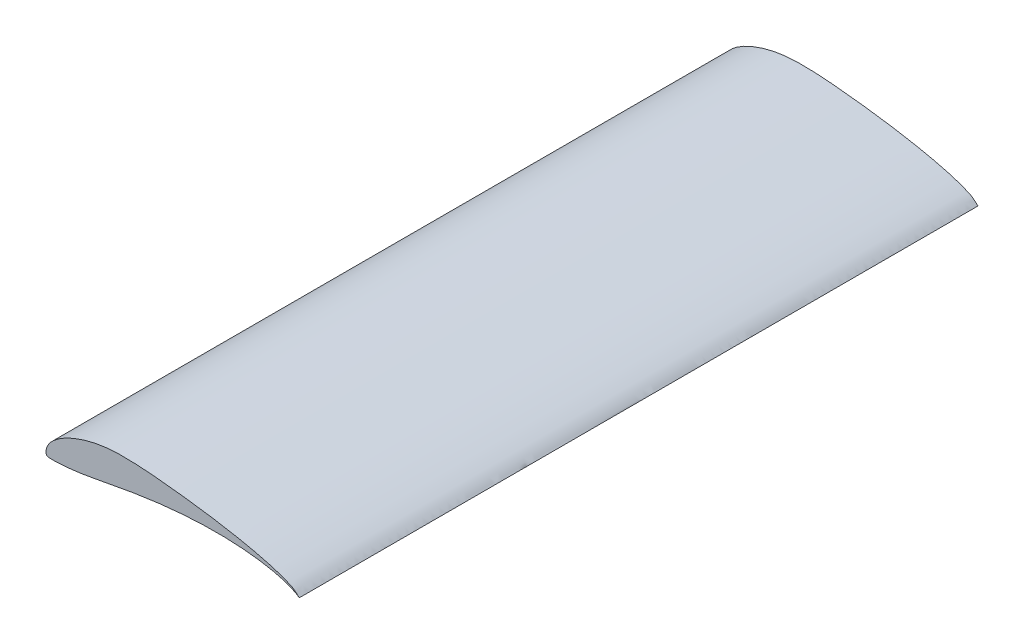
ISO-10303-21;
HEADER;
FILE_DESCRIPTION(('STEP AP214'),'2;1');
FILE_NAME('part.step','',(''),(''),'','','');
FILE_SCHEMA(('AUTOMOTIVE_DESIGN { 1 0 10303 214 1 1 1 1 }'));
ENDSEC;
DATA;
#1=APPLICATION_CONTEXT('core data for automotive mechanical design processes');
#2=APPLICATION_PROTOCOL_DEFINITION('international standard','automotive_design',2000,#1);
#3=PRODUCT_CONTEXT('',#1,'mechanical');
#4=PRODUCT('Part','Part','',(#3));
#5=PRODUCT_RELATED_PRODUCT_CATEGORY('part','',(#4));
#6=PRODUCT_DEFINITION_FORMATION('','',#4);
#7=PRODUCT_DEFINITION_CONTEXT('part definition',#1,'design');
#8=PRODUCT_DEFINITION('design','',#6,#7);
#9=PRODUCT_DEFINITION_SHAPE('','',#8);
#10=(LENGTH_UNIT() NAMED_UNIT(*) SI_UNIT(.MILLI.,.METRE.));
#11=(NAMED_UNIT(*) PLANE_ANGLE_UNIT() SI_UNIT($,.RADIAN.));
#12=(NAMED_UNIT(*) SI_UNIT($,.STERADIAN.) SOLID_ANGLE_UNIT());
#13=UNCERTAINTY_MEASURE_WITH_UNIT(LENGTH_MEASURE(1.E-05),#10,'distance_accuracy_value','');
#14=(GEOMETRIC_REPRESENTATION_CONTEXT(3) GLOBAL_UNCERTAINTY_ASSIGNED_CONTEXT((#13)) GLOBAL_UNIT_ASSIGNED_CONTEXT((#10,
#11,#12)) REPRESENTATION_CONTEXT('',''));
#15=CARTESIAN_POINT('',(0.,0.,0.));
#16=DIRECTION('',(0.,0.,1.));
#17=DIRECTION('',(1.,0.,0.));
#18=AXIS2_PLACEMENT_3D('',#15,#16,#17);
#19=CARTESIAN_POINT('',(355.6,0.,952.5));
#20=CARTESIAN_POINT('',(355.602128839233,0.00905257865664255,952.5));
#21=CARTESIAN_POINT('',(354.433140978384,0.8800281610502,952.5));
#22=CARTESIAN_POINT('',(353.444501711092,1.85005455162459,952.5));
#23=CARTESIAN_POINT('',(351.249323177412,3.87614569589336,952.5));
#24=CARTESIAN_POINT('',(348.659525751766,6.03151924957843,952.5));
#25=CARTESIAN_POINT('',(345.116905318303,8.20437560749415,952.5));
#26=CARTESIAN_POINT('',(340.711629882798,10.3101190603646,952.5));
#27=CARTESIAN_POINT('',(335.393425673829,12.5077174088594,952.5));
#28=CARTESIAN_POINT('',(329.170399195785,14.7665711312823,952.5));
#29=CARTESIAN_POINT('',(322.07158272521,17.0707231031482,952.5));
#30=CARTESIAN_POINT('',(314.13382869535,19.4001677933744,952.5));
#31=CARTESIAN_POINT('',(305.401586316021,21.7439719074938,952.5));
#32=CARTESIAN_POINT('',(295.923071256142,24.0806148471079,952.5));
#33=CARTESIAN_POINT('',(285.752626316274,26.3931817659485,952.5));
#34=CARTESIAN_POINT('',(274.950869855428,28.6672283865245,952.5));
#35=CARTESIAN_POINT('',(263.583762408773,30.8910643713945,952.5));
#36=CARTESIAN_POINT('',(251.717739615531,33.0373241061143,952.5));
#37=CARTESIAN_POINT('',(239.427524052225,35.10294120027,952.5));
#38=CARTESIAN_POINT('',(226.783945210423,37.061316862598,952.5));
#39=CARTESIAN_POINT('',(213.868769441891,38.9162752047643,952.5));
#40=CARTESIAN_POINT('',(200.764767606806,40.6531166071968,952.5));
#41=CARTESIAN_POINT('',(187.566852051127,42.2662832725131,952.5));
#42=CARTESIAN_POINT('',(174.380530098979,43.7671972953088,952.5));
#43=CARTESIAN_POINT('',(161.314964856538,45.1179867380239,952.5));
#44=CARTESIAN_POINT('',(148.476599483251,46.2933700407377,952.5));
#45=CARTESIAN_POINT('',(135.955728548367,47.2271902117008,952.5));
#46=CARTESIAN_POINT('',(123.823875864113,47.8695386381412,952.5));
#47=CARTESIAN_POINT('',(112.148534892479,48.1469346178072,952.5));
#48=CARTESIAN_POINT('',(100.989516745191,48.1174076280814,952.5));
#49=CARTESIAN_POINT('',(90.3676373078495,47.5710294725793,952.5));
#50=CARTESIAN_POINT('',(80.2787819547357,46.4638187537541,952.5));
#51=CARTESIAN_POINT('',(70.6818812127756,44.8982063778645,952.5));
#52=CARTESIAN_POINT('',(61.5746188615317,42.8699693660453,952.5));
#53=CARTESIAN_POINT('',(52.9663512848568,40.4915785454029,952.5));
#54=CARTESIAN_POINT('',(44.8935011264766,37.8051588588699,952.5));
#55=CARTESIAN_POINT('',(37.3904014736481,34.8735323274963,952.5));
#56=CARTESIAN_POINT('',(30.5036774663957,31.712405529247,952.5));
#57=CARTESIAN_POINT('',(24.2554145014104,28.3859584320498,952.5));
#58=CARTESIAN_POINT('',(18.6796051822039,24.9320191651614,952.5));
#59=CARTESIAN_POINT('',(13.811215985407,21.3973916013314,952.5));
#60=CARTESIAN_POINT('',(9.65225560370303,17.8569964494132,952.5));
#61=CARTESIAN_POINT('',(6.26303626987923,14.2721876357294,952.5));
#62=CARTESIAN_POINT('',(3.65968351969902,10.6740096816049,952.5));
#63=CARTESIAN_POINT('',(1.73665241115201,7.17346172131277,952.5));
#64=CARTESIAN_POINT('',(0.504192981572073,3.84985728346983,952.5));
#65=CARTESIAN_POINT('',(-0.0830739963663081,0.782171392686961,952.5));
#66=CARTESIAN_POINT('',(0.0302844236153766,-1.81236374784161,952.5));
#67=CARTESIAN_POINT('',(0.698257611801773,-4.19197054401551,952.5));
#68=CARTESIAN_POINT('',(3.18122091187247,-5.37322479022704,952.5));
#69=CARTESIAN_POINT('',(6.51959767179163,-5.5389510407461,952.5));
#70=CARTESIAN_POINT('',(11.0864846329763,-5.69957357450488,952.5));
#71=CARTESIAN_POINT('',(16.8296672974033,-5.45191547845621,952.5));
#72=CARTESIAN_POINT('',(23.6842363561708,-4.99679537096036,952.5));
#73=CARTESIAN_POINT('',(31.5739076107665,-4.26779164951018,952.5));
#74=CARTESIAN_POINT('',(40.4179478604171,-3.28141827021386,952.5));
#75=CARTESIAN_POINT('',(50.1732312409953,-2.01650943971448,952.5));
#76=CARTESIAN_POINT('',(60.8349904894309,-0.24861113661137,952.5));
#77=CARTESIAN_POINT('',(72.4551367968201,1.96830467841738,952.5));
#78=CARTESIAN_POINT('',(85.0917630728771,4.38101652220943,952.5));
#79=CARTESIAN_POINT('',(98.6831025194234,6.9284943271742,952.5));
#80=CARTESIAN_POINT('',(113.143787230334,9.50500042119454,952.5));
#81=CARTESIAN_POINT('',(128.367617419531,12.013841552219,952.5));
#82=CARTESIAN_POINT('',(144.236485554588,14.3712409496977,952.5));
#83=CARTESIAN_POINT('',(160.613634461524,16.4907207241703,952.5));
#84=CARTESIAN_POINT('',(177.351789026275,18.3105667389564,952.5));
#85=CARTESIAN_POINT('',(194.292835689016,19.7490800809445,952.5));
#86=CARTESIAN_POINT('',(211.266766871471,20.7688086640634,952.5));
#87=CARTESIAN_POINT('',(228.096248564287,21.3294099490697,952.5));
#88=CARTESIAN_POINT('',(244.598710423796,21.4002179081022,952.5));
#89=CARTESIAN_POINT('',(260.590041642155,20.9764214709169,952.5));
#90=CARTESIAN_POINT('',(275.887132003497,20.067941794691,952.5));
#91=CARTESIAN_POINT('',(290.306036162185,18.6865007136707,952.5));
#92=CARTESIAN_POINT('',(303.675088430976,16.8851246883896,952.5));
#93=CARTESIAN_POINT('',(315.820228030423,14.7160828611717,952.5));
#94=CARTESIAN_POINT('',(326.599058576612,12.2520191308015,952.5));
#95=CARTESIAN_POINT('',(335.812931173765,9.61536116540537,952.5));
#96=CARTESIAN_POINT('',(343.353535673268,6.80129216120097,952.5));
#97=CARTESIAN_POINT('',(348.733562877535,4.22605875013868,952.5));
#98=CARTESIAN_POINT('',(352.70011331161,1.8449114380105,952.5));
#99=CARTESIAN_POINT('',(354.223891420838,0.923446708618992,952.5));
#100=CARTESIAN_POINT('',(355.597827881658,-0.00923661676230017,952.5));
#101=CARTESIAN_POINT('',(355.6,0.,952.5));
#102=B_SPLINE_CURVE_WITH_KNOTS('',3,(#19,#20,#21,#22,#23,#24,#25,#26,#27,#28,#29,#30,#31,#32,
#33,#34,#35,#36,#37,#38,#39,#40,#41,#42,#43,#44,#45,#46,#47,#48,#49,#50,#51,#52,#53,#54,#55,#56,
#57,#58,#59,#60,#61,#62,#63,#64,#65,#66,#67,#68,#69,#70,#71,#72,#73,#74,#75,#76,#77,#78,#79,#80,
#81,#82,#83,#84,#85,#86,#87,#88,#89,#90,#91,#92,#93,#94,#95,#96,#97,#98,#99,#100,#101),
.UNSPECIFIED.,.T.,.F.,(4,1,1,1,1,1,1,1,1,1,1,1,1,1,1,1,1,1,1,1,1,1,1,1,1,1,1,1,1,1,1,1,1,1,1,1,
1,1,1,1,1,1,1,1,1,1,1,1,1,1,1,1,1,1,1,1,1,1,1,1,1,1,1,1,1,1,1,1,1,1,1,1,1,1,1,1,1,1,1,1,4),(0.,
0.000979677557134139,0.00364886216776305,0.0074834985194781,0.0120952771855934,
0.0175255907768788,0.0240517799938711,0.0317830505527586,0.0406778280832618,0.0507103007904779,
0.0618332290621795,0.0739892504845854,0.0871181731906812,0.101145048769791,0.115990637111827,
0.131570421640589,0.147788379302961,0.164550916882416,0.181757895150531,0.199311954944345,
0.217095071712264,0.234990228463986,0.252856883122009,0.270540593729572,0.287886779266045,
0.304773437599674,0.321101419214061,0.336806063174811,0.351800032584037,0.366031063392082,
0.379615674919835,0.392652962879186,0.405170358707495,0.417171919049936,0.428603516911185,
0.439418959108259,0.449596586064162,0.459102079103161,0.467907877534646,0.475988300736527,
0.483308968746149,0.489874507816402,0.495803249719207,0.501149411695553,0.50590307325604,
0.510046768536663,0.513579310681042,0.516446926626751,0.5193500525909,0.523823355179486,
0.529973793997694,0.537715654387927,0.546967844488146,0.55763736682571,0.569620481096633,
0.582804124215616,0.597246960791633,0.613135036654701,0.630443600329816,0.649056123608546,
0.668822256795696,0.689594964002684,0.711189650864602,0.733426688964389,0.756094117504156,
0.778988553684861,0.801889682684955,0.824566597829707,0.846792284880412,0.868338290507787,
0.888978162959066,0.908492011340558,0.926658767581933,0.943286193042322,0.958169210358794,
0.971135821634751,0.981955623079976,0.990251791025976,0.995852565249962,0.999000405686701,1.),.UNSPECIFIED.);
#103=DIRECTION('',(0.,0.,-1.));
#104=VECTOR('',#103,1.);
#105=SURFACE_OF_LINEAR_EXTRUSION('',#102,#104);
#106=CARTESIAN_POINT('',(355.6,0.,952.5));
#107=VERTEX_POINT('',#106);
#108=EDGE_CURVE('E10',#107,#107,#102,.T.);
#109=ORIENTED_EDGE('',*,*,#108,.F.);
#110=EDGE_LOOP('',(#109));
#111=FACE_BOUND('',#110,.T.);
#112=CARTESIAN_POINT('',(355.6,0.,0.));
#113=CARTESIAN_POINT('',(355.602128839233,0.00905257865664255,0.));
#114=CARTESIAN_POINT('',(354.433140978384,0.8800281610502,0.));
#115=CARTESIAN_POINT('',(353.444501711092,1.85005455162459,0.));
#116=CARTESIAN_POINT('',(351.249323177412,3.87614569589336,0.));
#117=CARTESIAN_POINT('',(348.659525751766,6.03151924957843,0.));
#118=CARTESIAN_POINT('',(345.116905318303,8.20437560749415,0.));
#119=CARTESIAN_POINT('',(340.711629882798,10.3101190603646,0.));
#120=CARTESIAN_POINT('',(335.393425673829,12.5077174088594,0.));
#121=CARTESIAN_POINT('',(329.170399195785,14.7665711312823,0.));
#122=CARTESIAN_POINT('',(322.07158272521,17.0707231031482,0.));
#123=CARTESIAN_POINT('',(314.13382869535,19.4001677933744,0.));
#124=CARTESIAN_POINT('',(305.401586316021,21.7439719074938,0.));
#125=CARTESIAN_POINT('',(295.923071256142,24.0806148471079,0.));
#126=CARTESIAN_POINT('',(285.752626316274,26.3931817659485,0.));
#127=CARTESIAN_POINT('',(274.950869855428,28.6672283865245,0.));
#128=CARTESIAN_POINT('',(263.583762408773,30.8910643713945,0.));
#129=CARTESIAN_POINT('',(251.717739615531,33.0373241061143,0.));
#130=CARTESIAN_POINT('',(239.427524052225,35.10294120027,0.));
#131=CARTESIAN_POINT('',(226.783945210423,37.061316862598,0.));
#132=CARTESIAN_POINT('',(213.868769441891,38.9162752047643,0.));
#133=CARTESIAN_POINT('',(200.764767606806,40.6531166071968,0.));
#134=CARTESIAN_POINT('',(187.566852051127,42.2662832725131,0.));
#135=CARTESIAN_POINT('',(174.380530098979,43.7671972953088,0.));
#136=CARTESIAN_POINT('',(161.314964856538,45.1179867380239,0.));
#137=CARTESIAN_POINT('',(148.476599483251,46.2933700407377,0.));
#138=CARTESIAN_POINT('',(135.955728548367,47.2271902117008,0.));
#139=CARTESIAN_POINT('',(123.823875864113,47.8695386381412,0.));
#140=CARTESIAN_POINT('',(112.148534892479,48.1469346178072,0.));
#141=CARTESIAN_POINT('',(100.989516745191,48.1174076280814,0.));
#142=CARTESIAN_POINT('',(90.3676373078495,47.5710294725793,0.));
#143=CARTESIAN_POINT('',(80.2787819547357,46.4638187537541,0.));
#144=CARTESIAN_POINT('',(70.6818812127756,44.8982063778645,0.));
#145=CARTESIAN_POINT('',(61.5746188615317,42.8699693660453,0.));
#146=CARTESIAN_POINT('',(52.9663512848568,40.4915785454029,0.));
#147=CARTESIAN_POINT('',(44.8935011264766,37.8051588588699,0.));
#148=CARTESIAN_POINT('',(37.3904014736481,34.8735323274963,0.));
#149=CARTESIAN_POINT('',(30.5036774663957,31.712405529247,0.));
#150=CARTESIAN_POINT('',(24.2554145014104,28.3859584320498,0.));
#151=CARTESIAN_POINT('',(18.6796051822039,24.9320191651614,0.));
#152=CARTESIAN_POINT('',(13.811215985407,21.3973916013314,0.));
#153=CARTESIAN_POINT('',(9.65225560370303,17.8569964494132,0.));
#154=CARTESIAN_POINT('',(6.26303626987923,14.2721876357294,0.));
#155=CARTESIAN_POINT('',(3.65968351969902,10.6740096816049,0.));
#156=CARTESIAN_POINT('',(1.73665241115201,7.17346172131277,0.));
#157=CARTESIAN_POINT('',(0.504192981572073,3.84985728346983,0.));
#158=CARTESIAN_POINT('',(-0.0830739963663081,0.782171392686961,0.));
#159=CARTESIAN_POINT('',(0.0302844236153766,-1.81236374784161,0.));
#160=CARTESIAN_POINT('',(0.698257611801773,-4.19197054401551,0.));
#161=CARTESIAN_POINT('',(3.18122091187247,-5.37322479022704,0.));
#162=CARTESIAN_POINT('',(6.51959767179163,-5.5389510407461,0.));
#163=CARTESIAN_POINT('',(11.0864846329763,-5.69957357450488,0.));
#164=CARTESIAN_POINT('',(16.8296672974033,-5.45191547845621,0.));
#165=CARTESIAN_POINT('',(23.6842363561708,-4.99679537096036,0.));
#166=CARTESIAN_POINT('',(31.5739076107665,-4.26779164951018,0.));
#167=CARTESIAN_POINT('',(40.4179478604171,-3.28141827021386,0.));
#168=CARTESIAN_POINT('',(50.1732312409953,-2.01650943971448,0.));
#169=CARTESIAN_POINT('',(60.8349904894309,-0.24861113661137,0.));
#170=CARTESIAN_POINT('',(72.4551367968201,1.96830467841738,0.));
#171=CARTESIAN_POINT('',(85.0917630728771,4.38101652220943,0.));
#172=CARTESIAN_POINT('',(98.6831025194234,6.9284943271742,0.));
#173=CARTESIAN_POINT('',(113.143787230334,9.50500042119454,0.));
#174=CARTESIAN_POINT('',(128.367617419531,12.013841552219,0.));
#175=CARTESIAN_POINT('',(144.236485554588,14.3712409496977,0.));
#176=CARTESIAN_POINT('',(160.613634461524,16.4907207241703,0.));
#177=CARTESIAN_POINT('',(177.351789026275,18.3105667389564,0.));
#178=CARTESIAN_POINT('',(194.292835689016,19.7490800809445,0.));
#179=CARTESIAN_POINT('',(211.266766871471,20.7688086640634,0.));
#180=CARTESIAN_POINT('',(228.096248564287,21.3294099490697,0.));
#181=CARTESIAN_POINT('',(244.598710423796,21.4002179081022,0.));
#182=CARTESIAN_POINT('',(260.590041642155,20.9764214709169,0.));
#183=CARTESIAN_POINT('',(275.887132003497,20.067941794691,0.));
#184=CARTESIAN_POINT('',(290.306036162185,18.6865007136707,0.));
#185=CARTESIAN_POINT('',(303.675088430976,16.8851246883896,0.));
#186=CARTESIAN_POINT('',(315.820228030423,14.7160828611717,0.));
#187=CARTESIAN_POINT('',(326.599058576612,12.2520191308015,0.));
#188=CARTESIAN_POINT('',(335.812931173765,9.61536116540537,0.));
#189=CARTESIAN_POINT('',(343.353535673268,6.80129216120097,0.));
#190=CARTESIAN_POINT('',(348.733562877535,4.22605875013868,0.));
#191=CARTESIAN_POINT('',(352.70011331161,1.8449114380105,0.));
#192=CARTESIAN_POINT('',(354.223891420838,0.923446708618992,0.));
#193=CARTESIAN_POINT('',(355.597827881658,-0.00923661676230017,0.));
#194=CARTESIAN_POINT('',(355.6,0.,0.));
#195=B_SPLINE_CURVE_WITH_KNOTS('',3,(#112,#113,#114,#115,#116,#117,#118,#119,#120,#121,#122,
#123,#124,#125,#126,#127,#128,#129,#130,#131,#132,#133,#134,#135,#136,#137,#138,#139,#140,#141,
#142,#143,#144,#145,#146,#147,#148,#149,#150,#151,#152,#153,#154,#155,#156,#157,#158,#159,#160,
#161,#162,#163,#164,#165,#166,#167,#168,#169,#170,#171,#172,#173,#174,#175,#176,#177,#178,#179,
#180,#181,#182,#183,#184,#185,#186,#187,#188,#189,#190,#191,#192,#193,#194),.UNSPECIFIED.,.T.,
.F.,(4,1,1,1,1,1,1,1,1,1,1,1,1,1,1,1,1,1,1,1,1,1,1,1,1,1,1,1,1,1,1,1,1,1,1,1,1,1,1,1,1,1,1,1,1,
1,1,1,1,1,1,1,1,1,1,1,1,1,1,1,1,1,1,1,1,1,1,1,1,1,1,1,1,1,1,1,1,1,1,1,4),(0.,
0.000979677557134139,0.00364886216776305,0.0074834985194781,0.0120952771855934,
0.0175255907768788,0.0240517799938711,0.0317830505527586,0.0406778280832618,0.0507103007904779,
0.0618332290621795,0.0739892504845854,0.0871181731906812,0.101145048769791,0.115990637111827,
0.131570421640589,0.147788379302961,0.164550916882416,0.181757895150531,0.199311954944345,
0.217095071712264,0.234990228463986,0.252856883122009,0.270540593729572,0.287886779266045,
0.304773437599674,0.321101419214061,0.336806063174811,0.351800032584037,0.366031063392082,
0.379615674919835,0.392652962879186,0.405170358707495,0.417171919049936,0.428603516911185,
0.439418959108259,0.449596586064162,0.459102079103161,0.467907877534646,0.475988300736527,
0.483308968746149,0.489874507816402,0.495803249719207,0.501149411695553,0.50590307325604,
0.510046768536663,0.513579310681042,0.516446926626751,0.5193500525909,0.523823355179486,
0.529973793997694,0.537715654387927,0.546967844488146,0.55763736682571,0.569620481096633,
0.582804124215616,0.597246960791633,0.613135036654701,0.630443600329816,0.649056123608546,
0.668822256795696,0.689594964002684,0.711189650864602,0.733426688964389,0.756094117504156,
0.778988553684861,0.801889682684955,0.824566597829707,0.846792284880412,0.868338290507787,
0.888978162959066,0.908492011340558,0.926658767581933,0.943286193042322,0.958169210358794,
0.971135821634751,0.981955623079976,0.990251791025976,0.995852565249962,0.999000405686701,1.),.UNSPECIFIED.);
#196=CARTESIAN_POINT('',(355.6,0.,0.));
#197=VERTEX_POINT('',#196);
#198=EDGE_CURVE('E34',#197,#197,#195,.T.);
#199=ORIENTED_EDGE('',*,*,#198,.T.);
#200=EDGE_LOOP('',(#199));
#201=FACE_BOUND('',#200,.T.);
#202=ADVANCED_FACE('F30',(#111,#201),#105,.F.);
#203=CARTESIAN_POINT('',(2.12571114545663,7.77625533739161,952.5));
#204=DIRECTION('',(0.,0.,-1.));
#205=DIRECTION('',(-1.,0.,0.));
#206=AXIS2_PLACEMENT_3D('',#203,#204,#205);
#207=PLANE('',#206);
#208=ORIENTED_EDGE('',*,*,#108,.T.);
#209=EDGE_LOOP('',(#208));
#210=FACE_BOUND('',#209,.T.);
#211=ADVANCED_FACE('F53',(#210),#207,.F.);
#212=CARTESIAN_POINT('',(2.12571114545663,7.77625533739161,0.));
#213=DIRECTION('',(0.,0.,-1.));
#214=DIRECTION('',(-1.,0.,0.));
#215=AXIS2_PLACEMENT_3D('',#212,#213,#214);
#216=PLANE('',#215);
#217=ORIENTED_EDGE('',*,*,#198,.F.);
#218=EDGE_LOOP('',(#217));
#219=FACE_BOUND('',#218,.T.);
#220=ADVANCED_FACE('F51',(#219),#216,.T.);
#221=CLOSED_SHELL('',(#202,#211,#220));
#222=MANIFOLD_SOLID_BREP('B2',#221);
#223=ADVANCED_BREP_SHAPE_REPRESENTATION('',(#18,#222),#14);
#224=SHAPE_DEFINITION_REPRESENTATION(#9,#223);
ENDSEC;
END-ISO-10303-21;
